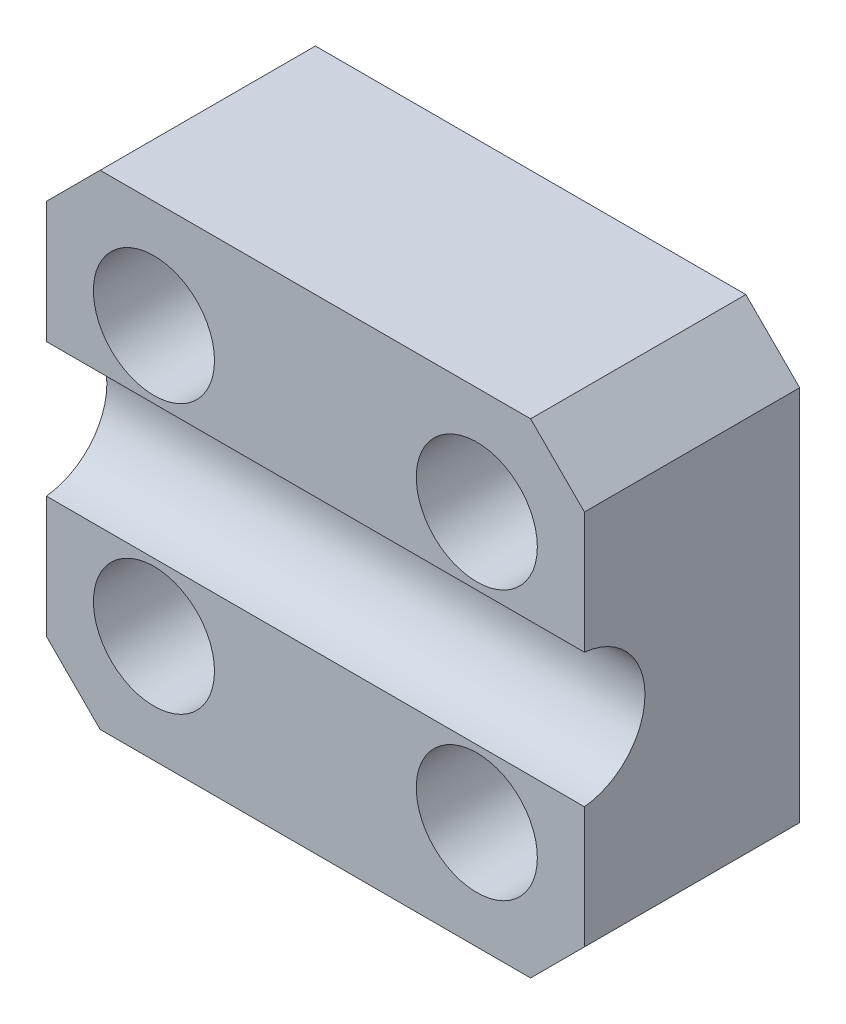
ISO-10303-21;
HEADER;
FILE_DESCRIPTION(('STEP AP214'),'2;1');
FILE_NAME('part.step','',(''),(''),'','','');
FILE_SCHEMA(('AUTOMOTIVE_DESIGN { 1 0 10303 214 1 1 1 1 }'));
ENDSEC;
DATA;
#1=APPLICATION_CONTEXT('core data for automotive mechanical design processes');
#2=APPLICATION_PROTOCOL_DEFINITION('international standard','automotive_design',2000,#1);
#3=PRODUCT_CONTEXT('',#1,'mechanical');
#4=PRODUCT('Part','Part','',(#3));
#5=PRODUCT_RELATED_PRODUCT_CATEGORY('part','',(#4));
#6=PRODUCT_DEFINITION_FORMATION('','',#4);
#7=PRODUCT_DEFINITION_CONTEXT('part definition',#1,'design');
#8=PRODUCT_DEFINITION('design','',#6,#7);
#9=PRODUCT_DEFINITION_SHAPE('','',#8);
#10=(LENGTH_UNIT() NAMED_UNIT(*) SI_UNIT(.MILLI.,.METRE.));
#11=(NAMED_UNIT(*) PLANE_ANGLE_UNIT() SI_UNIT($,.RADIAN.));
#12=(NAMED_UNIT(*) SI_UNIT($,.STERADIAN.) SOLID_ANGLE_UNIT());
#13=UNCERTAINTY_MEASURE_WITH_UNIT(LENGTH_MEASURE(1.E-05),#10,'distance_accuracy_value','');
#14=(GEOMETRIC_REPRESENTATION_CONTEXT(3) GLOBAL_UNCERTAINTY_ASSIGNED_CONTEXT((#13)) GLOBAL_UNIT_ASSIGNED_CONTEXT((#10,
#11,#12)) REPRESENTATION_CONTEXT('',''));
#15=CARTESIAN_POINT('',(0.,0.,0.));
#16=DIRECTION('',(0.,0.,1.));
#17=DIRECTION('',(1.,0.,0.));
#18=AXIS2_PLACEMENT_3D('',#15,#16,#17);
#19=CARTESIAN_POINT('',(0.,0.,8.));
#20=DIRECTION('',(0.,0.,-1.));
#21=DIRECTION('',(-1.,0.,0.));
#22=AXIS2_PLACEMENT_3D('',#19,#20,#21);
#23=PLANE('',#22);
#24=CARTESIAN_POINT('',(-6.,5.,8.));
#25=DIRECTION('',(0.,0.,1.));
#26=DIRECTION('',(1.,0.,0.));
#27=AXIS2_PLACEMENT_3D('',#24,#25,#26);
#28=CIRCLE('',#27,2.25);
#29=CARTESIAN_POINT('',(-3.75,5.,8.));
#30=VERTEX_POINT('',#29);
#31=EDGE_CURVE('E148',#30,#30,#28,.T.);
#32=ORIENTED_EDGE('',*,*,#31,.F.);
#33=EDGE_LOOP('',(#32));
#34=FACE_BOUND('',#33,.T.);
#35=CARTESIAN_POINT('',(6.,5.,8.));
#36=DIRECTION('',(0.,0.,1.));
#37=DIRECTION('',(1.,0.,0.));
#38=AXIS2_PLACEMENT_3D('',#35,#36,#37);
#39=CIRCLE('',#38,2.25);
#40=CARTESIAN_POINT('',(8.25,5.,8.));
#41=VERTEX_POINT('',#40);
#42=EDGE_CURVE('E210',#41,#41,#39,.T.);
#43=ORIENTED_EDGE('',*,*,#42,.F.);
#44=EDGE_LOOP('',(#43));
#45=FACE_BOUND('',#44,.T.);
#46=DIRECTION('',(0.,-1.,0.));
#47=VECTOR('',#46,1.);
#48=CARTESIAN_POINT('',(-10.,7.,8.));
#49=LINE('',#48,#47);
#50=CARTESIAN_POINT('',(-10.,7.,8.));
#51=VERTEX_POINT('',#50);
#52=CARTESIAN_POINT('',(-10.,2.48746859276654,8.));
#53=VERTEX_POINT('',#52);
#54=EDGE_CURVE('E97',#51,#53,#49,.T.);
#55=ORIENTED_EDGE('',*,*,#54,.T.);
#56=DIRECTION('',(1.,0.,0.));
#57=VECTOR('',#56,1.);
#58=CARTESIAN_POINT('',(-10.001,2.48746859276654,8.));
#59=LINE('',#58,#57);
#60=CARTESIAN_POINT('',(10.,2.48746859276655,8.));
#61=VERTEX_POINT('',#60);
#62=EDGE_CURVE('E121',#61,#53,#59,.F.);
#63=ORIENTED_EDGE('',*,*,#62,.F.);
#64=DIRECTION('',(0.,1.,0.));
#65=VECTOR('',#64,1.);
#66=CARTESIAN_POINT('',(10.,7.,8.));
#67=LINE('',#66,#65);
#68=CARTESIAN_POINT('',(10.,7.,8.));
#69=VERTEX_POINT('',#68);
#70=EDGE_CURVE('E114',#61,#69,#67,.T.);
#71=ORIENTED_EDGE('',*,*,#70,.T.);
#72=DIRECTION('',(-0.707106781186548,0.707106781186548,0.));
#73=VECTOR('',#72,1.);
#74=CARTESIAN_POINT('',(8.,9.,8.));
#75=LINE('',#74,#73);
#76=CARTESIAN_POINT('',(8.,9.,8.));
#77=VERTEX_POINT('',#76);
#78=EDGE_CURVE('E117',#69,#77,#75,.T.);
#79=ORIENTED_EDGE('',*,*,#78,.T.);
#80=DIRECTION('',(-1.,0.,0.));
#81=VECTOR('',#80,1.);
#82=CARTESIAN_POINT('',(-8.,9.,8.));
#83=LINE('',#82,#81);
#84=CARTESIAN_POINT('',(-8.,9.,8.));
#85=VERTEX_POINT('',#84);
#86=EDGE_CURVE('E56',#77,#85,#83,.T.);
#87=ORIENTED_EDGE('',*,*,#86,.T.);
#88=DIRECTION('',(-0.707106781186548,-0.707106781186548,0.));
#89=VECTOR('',#88,1.);
#90=CARTESIAN_POINT('',(-10.,7.,8.));
#91=LINE('',#90,#89);
#92=EDGE_CURVE('E160',#85,#51,#91,.T.);
#93=ORIENTED_EDGE('',*,*,#92,.T.);
#94=EDGE_LOOP('',(#55,#63,#71,#79,#87,#93));
#95=FACE_BOUND('',#94,.T.);
#96=ADVANCED_FACE('F32',(#34,#45,#95),#23,.F.);
#97=CARTESIAN_POINT('',(10.,-7.,8.));
#98=VERTEX_POINT('',#97);
#99=CARTESIAN_POINT('',(10.,-2.48746859276655,8.));
#100=VERTEX_POINT('',#99);
#101=EDGE_CURVE('E123',#98,#100,#67,.T.);
#102=ORIENTED_EDGE('',*,*,#101,.T.);
#103=DIRECTION('',(1.,0.,0.));
#104=VECTOR('',#103,1.);
#105=CARTESIAN_POINT('',(-10.001,-2.48746859276656,8.));
#106=LINE('',#105,#104);
#107=CARTESIAN_POINT('',(-10.,-2.48746859276656,8.));
#108=VERTEX_POINT('',#107);
#109=EDGE_CURVE('E47',#108,#100,#106,.T.);
#110=ORIENTED_EDGE('',*,*,#109,.F.);
#111=CARTESIAN_POINT('',(-10.,-7.,8.));
#112=VERTEX_POINT('',#111);
#113=EDGE_CURVE('E199',#108,#112,#49,.T.);
#114=ORIENTED_EDGE('',*,*,#113,.T.);
#115=DIRECTION('',(0.707106781186548,-0.707106781186548,0.));
#116=VECTOR('',#115,1.);
#117=CARTESIAN_POINT('',(-10.,-7.,8.));
#118=LINE('',#117,#116);
#119=CARTESIAN_POINT('',(-8.,-9.,8.));
#120=VERTEX_POINT('',#119);
#121=EDGE_CURVE('E176',#112,#120,#118,.T.);
#122=ORIENTED_EDGE('',*,*,#121,.T.);
#123=DIRECTION('',(1.,0.,0.));
#124=VECTOR('',#123,1.);
#125=CARTESIAN_POINT('',(-8.,-9.,8.));
#126=LINE('',#125,#124);
#127=CARTESIAN_POINT('',(8.,-9.,8.));
#128=VERTEX_POINT('',#127);
#129=EDGE_CURVE('E194',#120,#128,#126,.T.);
#130=ORIENTED_EDGE('',*,*,#129,.T.);
#131=DIRECTION('',(0.707106781186548,0.707106781186548,0.));
#132=VECTOR('',#131,1.);
#133=CARTESIAN_POINT('',(8.,-9.,8.));
#134=LINE('',#133,#132);
#135=EDGE_CURVE('E124',#128,#98,#134,.T.);
#136=ORIENTED_EDGE('',*,*,#135,.T.);
#137=EDGE_LOOP('',(#102,#110,#114,#122,#130,#136));
#138=FACE_BOUND('',#137,.T.);
#139=CARTESIAN_POINT('',(-6.,-5.,8.));
#140=DIRECTION('',(0.,0.,1.));
#141=DIRECTION('',(1.,0.,0.));
#142=AXIS2_PLACEMENT_3D('',#139,#140,#141);
#143=CIRCLE('',#142,2.25);
#144=CARTESIAN_POINT('',(-3.75,-5.,8.));
#145=VERTEX_POINT('',#144);
#146=EDGE_CURVE('E204',#145,#145,#143,.T.);
#147=ORIENTED_EDGE('',*,*,#146,.F.);
#148=EDGE_LOOP('',(#147));
#149=FACE_BOUND('',#148,.T.);
#150=CARTESIAN_POINT('',(6.,-5.,8.));
#151=DIRECTION('',(0.,0.,1.));
#152=DIRECTION('',(1.,0.,0.));
#153=AXIS2_PLACEMENT_3D('',#150,#151,#152);
#154=CIRCLE('',#153,2.25);
#155=CARTESIAN_POINT('',(8.25,-5.,8.));
#156=VERTEX_POINT('',#155);
#157=EDGE_CURVE('E216',#156,#156,#154,.T.);
#158=ORIENTED_EDGE('',*,*,#157,.F.);
#159=EDGE_LOOP('',(#158));
#160=FACE_BOUND('',#159,.T.);
#161=ADVANCED_FACE('F249',(#138,#149,#160),#23,.F.);
#162=CARTESIAN_POINT('',(0.,0.,0.));
#163=DIRECTION('',(0.,0.,-1.));
#164=DIRECTION('',(-1.,0.,0.));
#165=AXIS2_PLACEMENT_3D('',#162,#163,#164);
#166=PLANE('',#165);
#167=CARTESIAN_POINT('',(6.,5.,0.));
#168=DIRECTION('',(0.,0.,1.));
#169=DIRECTION('',(1.,0.,0.));
#170=AXIS2_PLACEMENT_3D('',#167,#168,#169);
#171=CIRCLE('',#170,2.25);
#172=CARTESIAN_POINT('',(8.25,5.,0.));
#173=VERTEX_POINT('',#172);
#174=EDGE_CURVE('E213',#173,#173,#171,.T.);
#175=ORIENTED_EDGE('',*,*,#174,.T.);
#176=EDGE_LOOP('',(#175));
#177=FACE_BOUND('',#176,.T.);
#178=CARTESIAN_POINT('',(-6.,5.,0.));
#179=DIRECTION('',(0.,0.,1.));
#180=DIRECTION('',(1.,0.,0.));
#181=AXIS2_PLACEMENT_3D('',#178,#179,#180);
#182=CIRCLE('',#181,2.25);
#183=CARTESIAN_POINT('',(-3.75,5.,0.));
#184=VERTEX_POINT('',#183);
#185=EDGE_CURVE('E201',#184,#184,#182,.T.);
#186=ORIENTED_EDGE('',*,*,#185,.T.);
#187=EDGE_LOOP('',(#186));
#188=FACE_BOUND('',#187,.T.);
#189=DIRECTION('',(-0.707106781186548,-0.707106781186548,0.));
#190=VECTOR('',#189,1.);
#191=CARTESIAN_POINT('',(-10.,7.,0.));
#192=LINE('',#191,#190);
#193=CARTESIAN_POINT('',(-8.,9.,0.));
#194=VERTEX_POINT('',#193);
#195=CARTESIAN_POINT('',(-10.,7.,0.));
#196=VERTEX_POINT('',#195);
#197=EDGE_CURVE('E144',#194,#196,#192,.T.);
#198=ORIENTED_EDGE('',*,*,#197,.F.);
#199=DIRECTION('',(-1.,0.,0.));
#200=VECTOR('',#199,1.);
#201=CARTESIAN_POINT('',(-8.,9.,0.));
#202=LINE('',#201,#200);
#203=CARTESIAN_POINT('',(8.,9.,0.));
#204=VERTEX_POINT('',#203);
#205=EDGE_CURVE('E89',#204,#194,#202,.T.);
#206=ORIENTED_EDGE('',*,*,#205,.F.);
#207=DIRECTION('',(-0.707106781186548,0.707106781186548,0.));
#208=VECTOR('',#207,1.);
#209=CARTESIAN_POINT('',(8.,9.,0.));
#210=LINE('',#209,#208);
#211=CARTESIAN_POINT('',(10.,7.,0.));
#212=VERTEX_POINT('',#211);
#213=EDGE_CURVE('E157',#212,#204,#210,.T.);
#214=ORIENTED_EDGE('',*,*,#213,.F.);
#215=DIRECTION('',(0.,1.,0.));
#216=VECTOR('',#215,1.);
#217=CARTESIAN_POINT('',(10.,7.,0.));
#218=LINE('',#217,#216);
#219=CARTESIAN_POINT('',(10.,-7.,0.));
#220=VERTEX_POINT('',#219);
#221=EDGE_CURVE('E131',#220,#212,#218,.T.);
#222=ORIENTED_EDGE('',*,*,#221,.F.);
#223=DIRECTION('',(0.707106781186548,0.707106781186548,0.));
#224=VECTOR('',#223,1.);
#225=CARTESIAN_POINT('',(8.,-9.,0.));
#226=LINE('',#225,#224);
#227=CARTESIAN_POINT('',(8.,-9.,0.));
#228=VERTEX_POINT('',#227);
#229=EDGE_CURVE('E154',#228,#220,#226,.T.);
#230=ORIENTED_EDGE('',*,*,#229,.F.);
#231=DIRECTION('',(1.,0.,0.));
#232=VECTOR('',#231,1.);
#233=CARTESIAN_POINT('',(-8.,-9.,0.));
#234=LINE('',#233,#232);
#235=CARTESIAN_POINT('',(-8.,-9.,0.));
#236=VERTEX_POINT('',#235);
#237=EDGE_CURVE('E152',#236,#228,#234,.T.);
#238=ORIENTED_EDGE('',*,*,#237,.F.);
#239=DIRECTION('',(0.707106781186548,-0.707106781186548,0.));
#240=VECTOR('',#239,1.);
#241=CARTESIAN_POINT('',(-10.,-7.,0.));
#242=LINE('',#241,#240);
#243=CARTESIAN_POINT('',(-10.,-7.,0.));
#244=VERTEX_POINT('',#243);
#245=EDGE_CURVE('E150',#244,#236,#242,.T.);
#246=ORIENTED_EDGE('',*,*,#245,.F.);
#247=DIRECTION('',(0.,-1.,0.));
#248=VECTOR('',#247,1.);
#249=CARTESIAN_POINT('',(-10.,7.,0.));
#250=LINE('',#249,#248);
#251=EDGE_CURVE('E147',#196,#244,#250,.T.);
#252=ORIENTED_EDGE('',*,*,#251,.F.);
#253=EDGE_LOOP('',(#198,#206,#214,#222,#230,#238,#246,#252));
#254=FACE_BOUND('',#253,.T.);
#255=CARTESIAN_POINT('',(-6.,-5.,0.));
#256=DIRECTION('',(0.,0.,1.));
#257=DIRECTION('',(1.,0.,0.));
#258=AXIS2_PLACEMENT_3D('',#255,#256,#257);
#259=CIRCLE('',#258,2.25);
#260=CARTESIAN_POINT('',(-3.75,-5.,0.));
#261=VERTEX_POINT('',#260);
#262=EDGE_CURVE('E207',#261,#261,#259,.T.);
#263=ORIENTED_EDGE('',*,*,#262,.T.);
#264=EDGE_LOOP('',(#263));
#265=FACE_BOUND('',#264,.T.);
#266=CARTESIAN_POINT('',(6.,-5.,0.));
#267=DIRECTION('',(0.,0.,1.));
#268=DIRECTION('',(1.,0.,0.));
#269=AXIS2_PLACEMENT_3D('',#266,#267,#268);
#270=CIRCLE('',#269,2.25);
#271=CARTESIAN_POINT('',(8.25,-5.,0.));
#272=VERTEX_POINT('',#271);
#273=EDGE_CURVE('E219',#272,#272,#270,.T.);
#274=ORIENTED_EDGE('',*,*,#273,.T.);
#275=EDGE_LOOP('',(#274));
#276=FACE_BOUND('',#275,.T.);
#277=ADVANCED_FACE('F181',(#177,#188,#254,#265,#276),#166,.T.);
#278=CARTESIAN_POINT('',(-10.,7.,8.));
#279=DIRECTION('',(0.707106781186547,-0.707106781186547,0.));
#280=DIRECTION('',(0.707106781186548,0.707106781186548,0.));
#281=AXIS2_PLACEMENT_3D('',#278,#279,#280);
#282=PLANE('',#281);
#283=ORIENTED_EDGE('',*,*,#197,.T.);
#284=DIRECTION('',(0.,0.,-1.));
#285=VECTOR('',#284,1.);
#286=CARTESIAN_POINT('',(-10.,7.,8.));
#287=LINE('',#286,#285);
#288=EDGE_CURVE('E11',#51,#196,#287,.T.);
#289=ORIENTED_EDGE('',*,*,#288,.F.);
#290=ORIENTED_EDGE('',*,*,#92,.F.);
#291=DIRECTION('',(0.,0.,-1.));
#292=VECTOR('',#291,1.);
#293=CARTESIAN_POINT('',(-8.,9.,8.));
#294=LINE('',#293,#292);
#295=EDGE_CURVE('E139',#85,#194,#294,.T.);
#296=ORIENTED_EDGE('',*,*,#295,.T.);
#297=EDGE_LOOP('',(#283,#289,#290,#296));
#298=FACE_BOUND('',#297,.T.);
#299=ADVANCED_FACE('F34',(#298),#282,.F.);
#300=CARTESIAN_POINT('',(-10.,7.,8.));
#301=DIRECTION('',(1.,0.,0.));
#302=DIRECTION('',(0.,1.,0.));
#303=AXIS2_PLACEMENT_3D('',#300,#301,#302);
#304=PLANE('',#303);
#305=ORIENTED_EDGE('',*,*,#113,.F.);
#306=CARTESIAN_POINT('',(-10.,0.,8.25));
#307=DIRECTION('',(1.,0.,0.));
#308=DIRECTION('',(0.,1.,0.));
#309=AXIS2_PLACEMENT_3D('',#306,#307,#308);
#310=CIRCLE('',#309,2.5);
#311=EDGE_CURVE('E222',#53,#108,#310,.F.);
#312=ORIENTED_EDGE('',*,*,#311,.F.);
#313=ORIENTED_EDGE('',*,*,#54,.F.);
#314=ORIENTED_EDGE('',*,*,#288,.T.);
#315=ORIENTED_EDGE('',*,*,#251,.T.);
#316=DIRECTION('',(0.,0.,-1.));
#317=VECTOR('',#316,1.);
#318=CARTESIAN_POINT('',(-10.,-7.,8.));
#319=LINE('',#318,#317);
#320=EDGE_CURVE('E40',#112,#244,#319,.T.);
#321=ORIENTED_EDGE('',*,*,#320,.F.);
#322=EDGE_LOOP('',(#305,#312,#313,#314,#315,#321));
#323=FACE_BOUND('',#322,.T.);
#324=ADVANCED_FACE('F231',(#323),#304,.F.);
#325=CARTESIAN_POINT('',(-10.,-7.,8.));
#326=DIRECTION('',(0.707106781186547,0.707106781186547,0.));
#327=DIRECTION('',(-0.707106781186548,0.707106781186548,0.));
#328=AXIS2_PLACEMENT_3D('',#325,#326,#327);
#329=PLANE('',#328);
#330=ORIENTED_EDGE('',*,*,#245,.T.);
#331=DIRECTION('',(0.,0.,-1.));
#332=VECTOR('',#331,1.);
#333=CARTESIAN_POINT('',(-8.,-9.,8.));
#334=LINE('',#333,#332);
#335=EDGE_CURVE('E167',#120,#236,#334,.T.);
#336=ORIENTED_EDGE('',*,*,#335,.F.);
#337=ORIENTED_EDGE('',*,*,#121,.F.);
#338=ORIENTED_EDGE('',*,*,#320,.T.);
#339=EDGE_LOOP('',(#330,#336,#337,#338));
#340=FACE_BOUND('',#339,.T.);
#341=ADVANCED_FACE('F174',(#340),#329,.F.);
#342=CARTESIAN_POINT('',(-8.,-9.,8.));
#343=DIRECTION('',(0.,1.,0.));
#344=DIRECTION('',(-1.,0.,0.));
#345=AXIS2_PLACEMENT_3D('',#342,#343,#344);
#346=PLANE('',#345);
#347=ORIENTED_EDGE('',*,*,#237,.T.);
#348=DIRECTION('',(0.,0.,-1.));
#349=VECTOR('',#348,1.);
#350=CARTESIAN_POINT('',(8.,-9.,8.));
#351=LINE('',#350,#349);
#352=EDGE_CURVE('E164',#128,#228,#351,.T.);
#353=ORIENTED_EDGE('',*,*,#352,.F.);
#354=ORIENTED_EDGE('',*,*,#129,.F.);
#355=ORIENTED_EDGE('',*,*,#335,.T.);
#356=EDGE_LOOP('',(#347,#353,#354,#355));
#357=FACE_BOUND('',#356,.T.);
#358=ADVANCED_FACE('F186',(#357),#346,.F.);
#359=CARTESIAN_POINT('',(8.,-9.,8.));
#360=DIRECTION('',(-0.707106781186547,0.707106781186547,0.));
#361=DIRECTION('',(-0.707106781186548,-0.707106781186548,0.));
#362=AXIS2_PLACEMENT_3D('',#359,#360,#361);
#363=PLANE('',#362);
#364=ORIENTED_EDGE('',*,*,#229,.T.);
#365=DIRECTION('',(0.,0.,-1.));
#366=VECTOR('',#365,1.);
#367=CARTESIAN_POINT('',(10.,-7.,8.));
#368=LINE('',#367,#366);
#369=EDGE_CURVE('E134',#98,#220,#368,.T.);
#370=ORIENTED_EDGE('',*,*,#369,.F.);
#371=ORIENTED_EDGE('',*,*,#135,.F.);
#372=ORIENTED_EDGE('',*,*,#352,.T.);
#373=EDGE_LOOP('',(#364,#370,#371,#372));
#374=FACE_BOUND('',#373,.T.);
#375=ADVANCED_FACE('F190',(#374),#363,.F.);
#376=CARTESIAN_POINT('',(10.,7.,8.));
#377=DIRECTION('',(-1.,0.,0.));
#378=DIRECTION('',(0.,-1.,0.));
#379=AXIS2_PLACEMENT_3D('',#376,#377,#378);
#380=PLANE('',#379);
#381=ORIENTED_EDGE('',*,*,#70,.F.);
#382=CARTESIAN_POINT('',(10.,0.,8.25));
#383=DIRECTION('',(1.,0.,0.));
#384=DIRECTION('',(0.,1.,0.));
#385=AXIS2_PLACEMENT_3D('',#382,#383,#384);
#386=CIRCLE('',#385,2.5);
#387=EDGE_CURVE('E226',#100,#61,#386,.T.);
#388=ORIENTED_EDGE('',*,*,#387,.F.);
#389=ORIENTED_EDGE('',*,*,#101,.F.);
#390=ORIENTED_EDGE('',*,*,#369,.T.);
#391=ORIENTED_EDGE('',*,*,#221,.T.);
#392=DIRECTION('',(0.,0.,-1.));
#393=VECTOR('',#392,1.);
#394=CARTESIAN_POINT('',(10.,7.,8.));
#395=LINE('',#394,#393);
#396=EDGE_CURVE('E127',#69,#212,#395,.T.);
#397=ORIENTED_EDGE('',*,*,#396,.F.);
#398=EDGE_LOOP('',(#381,#388,#389,#390,#391,#397));
#399=FACE_BOUND('',#398,.T.);
#400=ADVANCED_FACE('F128',(#399),#380,.F.);
#401=CARTESIAN_POINT('',(8.,9.,8.));
#402=DIRECTION('',(-0.707106781186547,-0.707106781186547,0.));
#403=DIRECTION('',(0.707106781186548,-0.707106781186548,0.));
#404=AXIS2_PLACEMENT_3D('',#401,#402,#403);
#405=PLANE('',#404);
#406=ORIENTED_EDGE('',*,*,#213,.T.);
#407=DIRECTION('',(0.,0.,-1.));
#408=VECTOR('',#407,1.);
#409=CARTESIAN_POINT('',(8.,9.,8.));
#410=LINE('',#409,#408);
#411=EDGE_CURVE('E135',#77,#204,#410,.T.);
#412=ORIENTED_EDGE('',*,*,#411,.F.);
#413=ORIENTED_EDGE('',*,*,#78,.F.);
#414=ORIENTED_EDGE('',*,*,#396,.T.);
#415=EDGE_LOOP('',(#406,#412,#413,#414));
#416=FACE_BOUND('',#415,.T.);
#417=ADVANCED_FACE('F137',(#416),#405,.F.);
#418=CARTESIAN_POINT('',(-8.,9.,8.));
#419=DIRECTION('',(0.,-1.,0.));
#420=DIRECTION('',(0.,0.,-1.));
#421=AXIS2_PLACEMENT_3D('',#418,#419,#420);
#422=PLANE('',#421);
#423=ORIENTED_EDGE('',*,*,#205,.T.);
#424=ORIENTED_EDGE('',*,*,#295,.F.);
#425=ORIENTED_EDGE('',*,*,#86,.F.);
#426=ORIENTED_EDGE('',*,*,#411,.T.);
#427=EDGE_LOOP('',(#423,#424,#425,#426));
#428=FACE_BOUND('',#427,.T.);
#429=ADVANCED_FACE('F235',(#428),#422,.F.);
#430=CARTESIAN_POINT('',(-6.,5.,8.));
#431=DIRECTION('',(0.,0.,-1.));
#432=DIRECTION('',(-1.,0.,0.));
#433=AXIS2_PLACEMENT_3D('',#430,#431,#432);
#434=CYLINDRICAL_SURFACE('',#433,2.25);
#435=ORIENTED_EDGE('',*,*,#31,.T.);
#436=EDGE_LOOP('',(#435));
#437=FACE_BOUND('',#436,.T.);
#438=ORIENTED_EDGE('',*,*,#185,.F.);
#439=EDGE_LOOP('',(#438));
#440=FACE_BOUND('',#439,.T.);
#441=ADVANCED_FACE('F237',(#437,#440),#434,.F.);
#442=CARTESIAN_POINT('',(-6.,-5.,8.));
#443=DIRECTION('',(0.,0.,-1.));
#444=DIRECTION('',(-1.,0.,0.));
#445=AXIS2_PLACEMENT_3D('',#442,#443,#444);
#446=CYLINDRICAL_SURFACE('',#445,2.25);
#447=ORIENTED_EDGE('',*,*,#146,.T.);
#448=EDGE_LOOP('',(#447));
#449=FACE_BOUND('',#448,.T.);
#450=ORIENTED_EDGE('',*,*,#262,.F.);
#451=EDGE_LOOP('',(#450));
#452=FACE_BOUND('',#451,.T.);
#453=ADVANCED_FACE('F243',(#449,#452),#446,.F.);
#454=CARTESIAN_POINT('',(6.,5.,8.));
#455=DIRECTION('',(0.,0.,-1.));
#456=DIRECTION('',(-1.,0.,0.));
#457=AXIS2_PLACEMENT_3D('',#454,#455,#456);
#458=CYLINDRICAL_SURFACE('',#457,2.25);
#459=ORIENTED_EDGE('',*,*,#42,.T.);
#460=EDGE_LOOP('',(#459));
#461=FACE_BOUND('',#460,.T.);
#462=ORIENTED_EDGE('',*,*,#174,.F.);
#463=EDGE_LOOP('',(#462));
#464=FACE_BOUND('',#463,.T.);
#465=ADVANCED_FACE('F268',(#461,#464),#458,.F.);
#466=CARTESIAN_POINT('',(6.,-5.,8.));
#467=DIRECTION('',(0.,0.,-1.));
#468=DIRECTION('',(-1.,0.,0.));
#469=AXIS2_PLACEMENT_3D('',#466,#467,#468);
#470=CYLINDRICAL_SURFACE('',#469,2.25);
#471=ORIENTED_EDGE('',*,*,#157,.T.);
#472=EDGE_LOOP('',(#471));
#473=FACE_BOUND('',#472,.T.);
#474=ORIENTED_EDGE('',*,*,#273,.F.);
#475=EDGE_LOOP('',(#474));
#476=FACE_BOUND('',#475,.T.);
#477=ADVANCED_FACE('F270',(#473,#476),#470,.F.);
#478=CARTESIAN_POINT('',(-10.001,0.,8.25));
#479=DIRECTION('',(1.,0.,0.));
#480=DIRECTION('',(0.,1.,0.));
#481=AXIS2_PLACEMENT_3D('',#478,#479,#480);
#482=CYLINDRICAL_SURFACE('',#481,2.5);
#483=ORIENTED_EDGE('',*,*,#62,.T.);
#484=ORIENTED_EDGE('',*,*,#311,.T.);
#485=ORIENTED_EDGE('',*,*,#109,.T.);
#486=ORIENTED_EDGE('',*,*,#387,.T.);
#487=EDGE_LOOP('',(#483,#484,#485,#486));
#488=FACE_BOUND('',#487,.T.);
#489=ADVANCED_FACE('F230',(#488),#482,.F.);
#490=CLOSED_SHELL('',(#96,#161,#277,#299,#324,#341,#358,#375,#400,#417,#429,#441,#453,#465,#477,#489));
#491=MANIFOLD_SOLID_BREP('B2',#490);
#492=ADVANCED_BREP_SHAPE_REPRESENTATION('',(#18,#491),#14);
#493=SHAPE_DEFINITION_REPRESENTATION(#9,#492);
ENDSEC;
END-ISO-10303-21;
